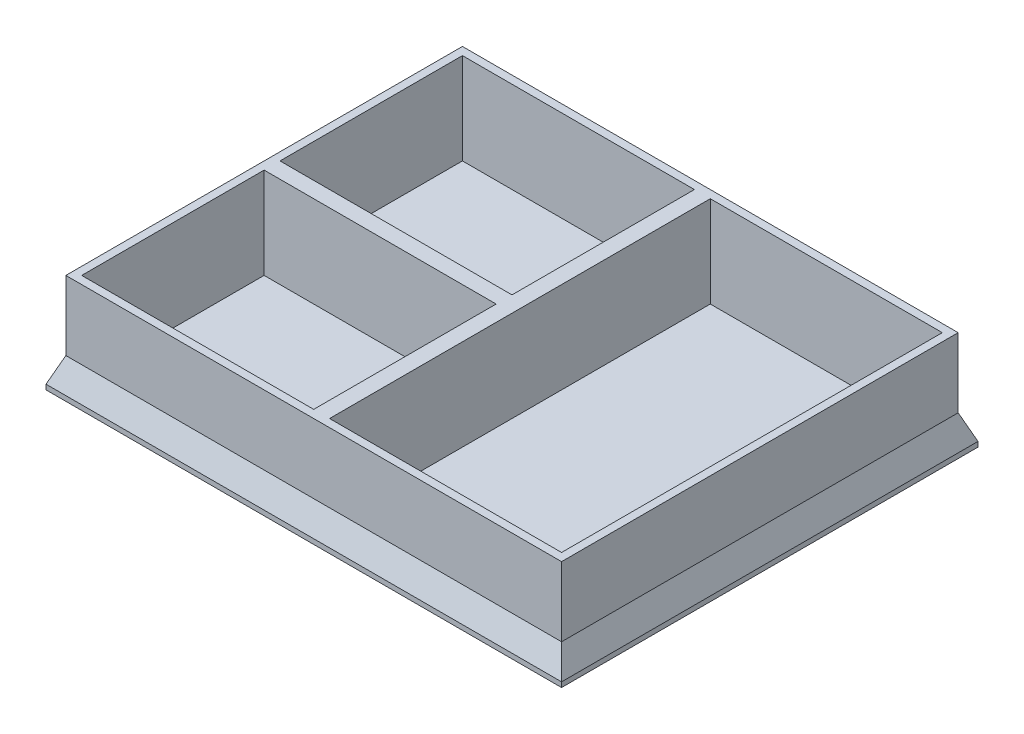
ISO-10303-21;
HEADER;
FILE_DESCRIPTION(('STEP AP214'),'2;1');
FILE_NAME('part.step','',(''),(''),'','','');
FILE_SCHEMA(('AUTOMOTIVE_DESIGN { 1 0 10303 214 1 1 1 1 }'));
ENDSEC;
DATA;
#1=APPLICATION_CONTEXT('core data for automotive mechanical design processes');
#2=APPLICATION_PROTOCOL_DEFINITION('international standard','automotive_design',2000,#1);
#3=PRODUCT_CONTEXT('',#1,'mechanical');
#4=PRODUCT('Part','Part','',(#3));
#5=PRODUCT_RELATED_PRODUCT_CATEGORY('part','',(#4));
#6=PRODUCT_DEFINITION_FORMATION('','',#4);
#7=PRODUCT_DEFINITION_CONTEXT('part definition',#1,'design');
#8=PRODUCT_DEFINITION('design','',#6,#7);
#9=PRODUCT_DEFINITION_SHAPE('','',#8);
#10=(LENGTH_UNIT() NAMED_UNIT(*) SI_UNIT(.MILLI.,.METRE.));
#11=(NAMED_UNIT(*) PLANE_ANGLE_UNIT() SI_UNIT($,.RADIAN.));
#12=(NAMED_UNIT(*) SI_UNIT($,.STERADIAN.) SOLID_ANGLE_UNIT());
#13=UNCERTAINTY_MEASURE_WITH_UNIT(LENGTH_MEASURE(1.E-05),#10,'distance_accuracy_value','');
#14=(GEOMETRIC_REPRESENTATION_CONTEXT(3) GLOBAL_UNCERTAINTY_ASSIGNED_CONTEXT((#13)) GLOBAL_UNIT_ASSIGNED_CONTEXT((#10,
#11,#12)) REPRESENTATION_CONTEXT('',''));
#15=CARTESIAN_POINT('',(0.,0.,0.));
#16=DIRECTION('',(0.,0.,1.));
#17=DIRECTION('',(1.,0.,0.));
#18=AXIS2_PLACEMENT_3D('',#15,#16,#17);
#19=CARTESIAN_POINT('',(0.,20.,-38.4));
#20=DIRECTION('',(0.,0.,-1.));
#21=DIRECTION('',(-1.,0.,0.));
#22=AXIS2_PLACEMENT_3D('',#19,#20,#21);
#23=PLANE('',#22);
#24=DIRECTION('',(-1.,0.,0.));
#25=VECTOR('',#24,1.);
#26=CARTESIAN_POINT('',(0.,1.6,-38.4));
#27=LINE('',#26,#25);
#28=CARTESIAN_POINT('',(48.4,1.6,-38.4));
#29=VERTEX_POINT('',#28);
#30=CARTESIAN_POINT('',(1.59999999999998,1.6,-38.4));
#31=VERTEX_POINT('',#30);
#32=EDGE_CURVE('E252',#29,#31,#27,.T.);
#33=ORIENTED_EDGE('',*,*,#32,.F.);
#34=DIRECTION('',(0.,-1.,0.));
#35=VECTOR('',#34,1.);
#36=CARTESIAN_POINT('',(48.4,20.,-38.4));
#37=LINE('',#36,#35);
#38=CARTESIAN_POINT('',(48.4,20.,-38.4));
#39=VERTEX_POINT('',#38);
#40=EDGE_CURVE('E324',#39,#29,#37,.T.);
#41=ORIENTED_EDGE('',*,*,#40,.F.);
#42=DIRECTION('',(1.,0.,0.));
#43=VECTOR('',#42,1.);
#44=CARTESIAN_POINT('',(0.,20.,-38.4));
#45=LINE('',#44,#43);
#46=CARTESIAN_POINT('',(1.59999999999998,20.,-38.4));
#47=VERTEX_POINT('',#46);
#48=EDGE_CURVE('E303',#47,#39,#45,.T.);
#49=ORIENTED_EDGE('',*,*,#48,.F.);
#50=DIRECTION('',(0.,-1.,0.));
#51=VECTOR('',#50,1.);
#52=CARTESIAN_POINT('',(1.59999999999998,20.,-38.4));
#53=LINE('',#52,#51);
#54=EDGE_CURVE('E314',#47,#31,#53,.T.);
#55=ORIENTED_EDGE('',*,*,#54,.T.);
#56=EDGE_LOOP('',(#33,#41,#49,#55));
#57=FACE_BOUND('',#56,.T.);
#58=ADVANCED_FACE('F35',(#57),#23,.F.);
#59=CARTESIAN_POINT('',(48.4,20.,0.));
#60=DIRECTION('',(1.,0.,0.));
#61=DIRECTION('',(0.,0.,-1.));
#62=AXIS2_PLACEMENT_3D('',#59,#60,#61);
#63=PLANE('',#62);
#64=DIRECTION('',(0.,0.,-1.));
#65=VECTOR('',#64,1.);
#66=CARTESIAN_POINT('',(48.4,1.6,0.));
#67=LINE('',#66,#65);
#68=CARTESIAN_POINT('',(48.4,1.6,38.4));
#69=VERTEX_POINT('',#68);
#70=EDGE_CURVE('E250',#69,#29,#67,.T.);
#71=ORIENTED_EDGE('',*,*,#70,.F.);
#72=DIRECTION('',(0.,-1.,0.));
#73=VECTOR('',#72,1.);
#74=CARTESIAN_POINT('',(48.4,20.,38.4));
#75=LINE('',#74,#73);
#76=CARTESIAN_POINT('',(48.4,20.,38.4));
#77=VERTEX_POINT('',#76);
#78=EDGE_CURVE('E321',#77,#69,#75,.T.);
#79=ORIENTED_EDGE('',*,*,#78,.F.);
#80=DIRECTION('',(0.,0.,1.));
#81=VECTOR('',#80,1.);
#82=CARTESIAN_POINT('',(48.4,20.,0.));
#83=LINE('',#82,#81);
#84=EDGE_CURVE('E306',#39,#77,#83,.T.);
#85=ORIENTED_EDGE('',*,*,#84,.F.);
#86=ORIENTED_EDGE('',*,*,#40,.T.);
#87=EDGE_LOOP('',(#71,#79,#85,#86));
#88=FACE_BOUND('',#87,.T.);
#89=ADVANCED_FACE('F380',(#88),#63,.F.);
#90=CARTESIAN_POINT('',(0.,20.,38.4));
#91=DIRECTION('',(0.,0.,-1.));
#92=DIRECTION('',(-1.,0.,0.));
#93=AXIS2_PLACEMENT_3D('',#90,#91,#92);
#94=PLANE('',#93);
#95=ORIENTED_EDGE('',*,*,#78,.T.);
#96=DIRECTION('',(-1.,0.,0.));
#97=VECTOR('',#96,1.);
#98=CARTESIAN_POINT('',(0.,1.6,38.4));
#99=LINE('',#98,#97);
#100=CARTESIAN_POINT('',(1.59999999999999,1.6,38.4));
#101=VERTEX_POINT('',#100);
#102=EDGE_CURVE('E242',#69,#101,#99,.T.);
#103=ORIENTED_EDGE('',*,*,#102,.T.);
#104=DIRECTION('',(0.,-1.,0.));
#105=VECTOR('',#104,1.);
#106=CARTESIAN_POINT('',(1.59999999999999,20.,38.4));
#107=LINE('',#106,#105);
#108=CARTESIAN_POINT('',(1.59999999999999,20.,38.4));
#109=VERTEX_POINT('',#108);
#110=EDGE_CURVE('E317',#109,#101,#107,.T.);
#111=ORIENTED_EDGE('',*,*,#110,.F.);
#112=DIRECTION('',(1.,0.,0.));
#113=VECTOR('',#112,1.);
#114=CARTESIAN_POINT('',(0.,20.,38.4));
#115=LINE('',#114,#113);
#116=EDGE_CURVE('E308',#109,#77,#115,.T.);
#117=ORIENTED_EDGE('',*,*,#116,.T.);
#118=EDGE_LOOP('',(#95,#103,#111,#117));
#119=FACE_BOUND('',#118,.T.);
#120=ADVANCED_FACE('F386',(#119),#94,.T.);
#121=CARTESIAN_POINT('',(0.,20.,1.60000000000002));
#122=DIRECTION('',(0.,0.,-1.));
#123=DIRECTION('',(-1.,0.,0.));
#124=AXIS2_PLACEMENT_3D('',#121,#122,#123);
#125=PLANE('',#124);
#126=DIRECTION('',(-1.,0.,0.));
#127=VECTOR('',#126,1.);
#128=CARTESIAN_POINT('',(0.,1.6,1.60000000000002));
#129=LINE('',#128,#127);
#130=CARTESIAN_POINT('',(-1.6,1.6,1.60000000000002));
#131=VERTEX_POINT('',#130);
#132=CARTESIAN_POINT('',(-48.4,1.6,1.60000000000002));
#133=VERTEX_POINT('',#132);
#134=EDGE_CURVE('E272',#131,#133,#129,.T.);
#135=ORIENTED_EDGE('',*,*,#134,.F.);
#136=DIRECTION('',(0.,-1.,0.));
#137=VECTOR('',#136,1.);
#138=CARTESIAN_POINT('',(-1.6,20.,1.60000000000002));
#139=LINE('',#138,#137);
#140=CARTESIAN_POINT('',(-1.6,20.,1.60000000000002));
#141=VERTEX_POINT('',#140);
#142=EDGE_CURVE('E318',#141,#131,#139,.T.);
#143=ORIENTED_EDGE('',*,*,#142,.F.);
#144=DIRECTION('',(1.,0.,0.));
#145=VECTOR('',#144,1.);
#146=CARTESIAN_POINT('',(0.,20.,1.60000000000002));
#147=LINE('',#146,#145);
#148=CARTESIAN_POINT('',(-48.4,20.,1.60000000000002));
#149=VERTEX_POINT('',#148);
#150=EDGE_CURVE('E292',#149,#141,#147,.T.);
#151=ORIENTED_EDGE('',*,*,#150,.F.);
#152=DIRECTION('',(0.,-1.,0.));
#153=VECTOR('',#152,1.);
#154=CARTESIAN_POINT('',(-48.4,20.,1.60000000000002));
#155=LINE('',#154,#153);
#156=EDGE_CURVE('E328',#149,#133,#155,.T.);
#157=ORIENTED_EDGE('',*,*,#156,.T.);
#158=EDGE_LOOP('',(#135,#143,#151,#157));
#159=FACE_BOUND('',#158,.T.);
#160=ADVANCED_FACE('F406',(#159),#125,.F.);
#161=CARTESIAN_POINT('',(-1.6,20.,0.));
#162=DIRECTION('',(1.,0.,0.));
#163=DIRECTION('',(0.,0.,-1.));
#164=AXIS2_PLACEMENT_3D('',#161,#162,#163);
#165=PLANE('',#164);
#166=DIRECTION('',(0.,0.,-1.));
#167=VECTOR('',#166,1.);
#168=CARTESIAN_POINT('',(-1.6,1.6,0.));
#169=LINE('',#168,#167);
#170=CARTESIAN_POINT('',(-1.59999999999999,1.6,38.4));
#171=VERTEX_POINT('',#170);
#172=EDGE_CURVE('E270',#171,#131,#169,.T.);
#173=ORIENTED_EDGE('',*,*,#172,.F.);
#174=DIRECTION('',(0.,-1.,0.));
#175=VECTOR('',#174,1.);
#176=CARTESIAN_POINT('',(-1.59999999999999,20.,38.4));
#177=LINE('',#176,#175);
#178=CARTESIAN_POINT('',(-1.59999999999999,20.,38.4));
#179=VERTEX_POINT('',#178);
#180=EDGE_CURVE('E335',#179,#171,#177,.T.);
#181=ORIENTED_EDGE('',*,*,#180,.F.);
#182=DIRECTION('',(0.,0.,1.));
#183=VECTOR('',#182,1.);
#184=CARTESIAN_POINT('',(-1.6,20.,0.));
#185=LINE('',#184,#183);
#186=EDGE_CURVE('E295',#141,#179,#185,.T.);
#187=ORIENTED_EDGE('',*,*,#186,.F.);
#188=ORIENTED_EDGE('',*,*,#142,.T.);
#189=EDGE_LOOP('',(#173,#181,#187,#188));
#190=FACE_BOUND('',#189,.T.);
#191=ADVANCED_FACE('F402',(#190),#165,.F.);
#192=CARTESIAN_POINT('',(0.,20.,38.4));
#193=DIRECTION('',(0.,0.,-1.));
#194=DIRECTION('',(-1.,0.,0.));
#195=AXIS2_PLACEMENT_3D('',#192,#193,#194);
#196=PLANE('',#195);
#197=ORIENTED_EDGE('',*,*,#180,.T.);
#198=DIRECTION('',(-1.,0.,0.));
#199=VECTOR('',#198,1.);
#200=CARTESIAN_POINT('',(0.,1.6,38.4));
#201=LINE('',#200,#199);
#202=CARTESIAN_POINT('',(-48.4,1.6,38.4));
#203=VERTEX_POINT('',#202);
#204=EDGE_CURVE('E267',#171,#203,#201,.T.);
#205=ORIENTED_EDGE('',*,*,#204,.T.);
#206=DIRECTION('',(0.,-1.,0.));
#207=VECTOR('',#206,1.);
#208=CARTESIAN_POINT('',(-48.4,20.,38.4));
#209=LINE('',#208,#207);
#210=CARTESIAN_POINT('',(-48.4,20.,38.4));
#211=VERTEX_POINT('',#210);
#212=EDGE_CURVE('E331',#211,#203,#209,.T.);
#213=ORIENTED_EDGE('',*,*,#212,.F.);
#214=DIRECTION('',(1.,0.,0.));
#215=VECTOR('',#214,1.);
#216=CARTESIAN_POINT('',(0.,20.,38.4));
#217=LINE('',#216,#215);
#218=EDGE_CURVE('E297',#211,#179,#217,.T.);
#219=ORIENTED_EDGE('',*,*,#218,.T.);
#220=EDGE_LOOP('',(#197,#205,#213,#219));
#221=FACE_BOUND('',#220,.T.);
#222=ADVANCED_FACE('F398',(#221),#196,.T.);
#223=CARTESIAN_POINT('',(0.,20.,-38.4));
#224=DIRECTION('',(0.,0.,-1.));
#225=DIRECTION('',(-1.,0.,0.));
#226=AXIS2_PLACEMENT_3D('',#223,#224,#225);
#227=PLANE('',#226);
#228=DIRECTION('',(-1.,0.,0.));
#229=VECTOR('',#228,1.);
#230=CARTESIAN_POINT('',(0.,1.6,-38.4));
#231=LINE('',#230,#229);
#232=CARTESIAN_POINT('',(-1.6,1.6,-38.4));
#233=VERTEX_POINT('',#232);
#234=CARTESIAN_POINT('',(-48.4,1.6,-38.4));
#235=VERTEX_POINT('',#234);
#236=EDGE_CURVE('E262',#233,#235,#231,.T.);
#237=ORIENTED_EDGE('',*,*,#236,.F.);
#238=DIRECTION('',(0.,-1.,0.));
#239=VECTOR('',#238,1.);
#240=CARTESIAN_POINT('',(-1.6,20.,-38.4));
#241=LINE('',#240,#239);
#242=CARTESIAN_POINT('',(-1.6,20.,-38.4));
#243=VERTEX_POINT('',#242);
#244=EDGE_CURVE('E332',#243,#233,#241,.T.);
#245=ORIENTED_EDGE('',*,*,#244,.F.);
#246=DIRECTION('',(1.,0.,0.));
#247=VECTOR('',#246,1.);
#248=CARTESIAN_POINT('',(0.,20.,-38.4));
#249=LINE('',#248,#247);
#250=CARTESIAN_POINT('',(-48.4,20.,-38.4));
#251=VERTEX_POINT('',#250);
#252=EDGE_CURVE('E281',#251,#243,#249,.T.);
#253=ORIENTED_EDGE('',*,*,#252,.F.);
#254=DIRECTION('',(0.,-1.,0.));
#255=VECTOR('',#254,1.);
#256=CARTESIAN_POINT('',(-48.4,20.,-38.4));
#257=LINE('',#256,#255);
#258=EDGE_CURVE('E196',#251,#235,#257,.T.);
#259=ORIENTED_EDGE('',*,*,#258,.T.);
#260=EDGE_LOOP('',(#237,#245,#253,#259));
#261=FACE_BOUND('',#260,.T.);
#262=ADVANCED_FACE('F401',(#261),#227,.F.);
#263=CARTESIAN_POINT('',(-1.59999999999999,20.,0.));
#264=DIRECTION('',(1.,0.,0.));
#265=DIRECTION('',(0.,0.,-1.));
#266=AXIS2_PLACEMENT_3D('',#263,#264,#265);
#267=PLANE('',#266);
#268=DIRECTION('',(0.,0.,-1.));
#269=VECTOR('',#268,1.);
#270=CARTESIAN_POINT('',(-1.59999999999999,1.6,0.));
#271=LINE('',#270,#269);
#272=CARTESIAN_POINT('',(-1.59999999999999,1.6,-1.6));
#273=VERTEX_POINT('',#272);
#274=EDGE_CURVE('E260',#273,#233,#271,.T.);
#275=ORIENTED_EDGE('',*,*,#274,.F.);
#276=DIRECTION('',(0.,-1.,0.));
#277=VECTOR('',#276,1.);
#278=CARTESIAN_POINT('',(-1.59999999999999,20.,-1.6));
#279=LINE('',#278,#277);
#280=CARTESIAN_POINT('',(-1.59999999999999,20.,-1.6));
#281=VERTEX_POINT('',#280);
#282=EDGE_CURVE('E345',#281,#273,#279,.T.);
#283=ORIENTED_EDGE('',*,*,#282,.F.);
#284=DIRECTION('',(0.,0.,1.));
#285=VECTOR('',#284,1.);
#286=CARTESIAN_POINT('',(-1.59999999999999,20.,0.));
#287=LINE('',#286,#285);
#288=EDGE_CURVE('E284',#243,#281,#287,.T.);
#289=ORIENTED_EDGE('',*,*,#288,.F.);
#290=ORIENTED_EDGE('',*,*,#244,.T.);
#291=EDGE_LOOP('',(#275,#283,#289,#290));
#292=FACE_BOUND('',#291,.T.);
#293=ADVANCED_FACE('F418',(#292),#267,.F.);
#294=CARTESIAN_POINT('',(0.,20.,-1.6));
#295=DIRECTION('',(0.,0.,-1.));
#296=DIRECTION('',(-1.,0.,0.));
#297=AXIS2_PLACEMENT_3D('',#294,#295,#296);
#298=PLANE('',#297);
#299=ORIENTED_EDGE('',*,*,#282,.T.);
#300=DIRECTION('',(-1.,0.,0.));
#301=VECTOR('',#300,1.);
#302=CARTESIAN_POINT('',(0.,1.6,-1.6));
#303=LINE('',#302,#301);
#304=CARTESIAN_POINT('',(-48.4,1.6,-1.6));
#305=VERTEX_POINT('',#304);
#306=EDGE_CURVE('E257',#273,#305,#303,.T.);
#307=ORIENTED_EDGE('',*,*,#306,.T.);
#308=DIRECTION('',(0.,-1.,0.));
#309=VECTOR('',#308,1.);
#310=CARTESIAN_POINT('',(-48.4,20.,-1.6));
#311=LINE('',#310,#309);
#312=CARTESIAN_POINT('',(-48.4,20.,-1.6));
#313=VERTEX_POINT('',#312);
#314=EDGE_CURVE('E342',#313,#305,#311,.T.);
#315=ORIENTED_EDGE('',*,*,#314,.F.);
#316=DIRECTION('',(1.,0.,0.));
#317=VECTOR('',#316,1.);
#318=CARTESIAN_POINT('',(0.,20.,-1.6));
#319=LINE('',#318,#317);
#320=EDGE_CURVE('E286',#313,#281,#319,.T.);
#321=ORIENTED_EDGE('',*,*,#320,.T.);
#322=EDGE_LOOP('',(#299,#307,#315,#321));
#323=FACE_BOUND('',#322,.T.);
#324=ADVANCED_FACE('F415',(#323),#298,.T.);
#325=CARTESIAN_POINT('',(50.,20.,0.));
#326=DIRECTION('',(1.,0.,0.));
#327=DIRECTION('',(0.,0.,-1.));
#328=AXIS2_PLACEMENT_3D('',#325,#326,#327);
#329=PLANE('',#328);
#330=DIRECTION('',(0.,0.,1.));
#331=VECTOR('',#330,1.);
#332=CARTESIAN_POINT('',(50.,6.,0.));
#333=LINE('',#332,#331);
#334=CARTESIAN_POINT('',(50.,6.,-40.));
#335=VERTEX_POINT('',#334);
#336=CARTESIAN_POINT('',(50.,6.,40.));
#337=VERTEX_POINT('',#336);
#338=EDGE_CURVE('E173',#335,#337,#333,.T.);
#339=ORIENTED_EDGE('',*,*,#338,.F.);
#340=DIRECTION('',(0.,-1.,0.));
#341=VECTOR('',#340,1.);
#342=CARTESIAN_POINT('',(50.,20.,-40.));
#343=LINE('',#342,#341);
#344=CARTESIAN_POINT('',(50.,20.,-40.));
#345=VERTEX_POINT('',#344);
#346=EDGE_CURVE('E177',#345,#335,#343,.T.);
#347=ORIENTED_EDGE('',*,*,#346,.F.);
#348=DIRECTION('',(0.,0.,1.));
#349=VECTOR('',#348,1.);
#350=CARTESIAN_POINT('',(50.,20.,0.));
#351=LINE('',#350,#349);
#352=CARTESIAN_POINT('',(50.,20.,40.));
#353=VERTEX_POINT('',#352);
#354=EDGE_CURVE('E274',#345,#353,#351,.T.);
#355=ORIENTED_EDGE('',*,*,#354,.T.);
#356=DIRECTION('',(0.,-1.,0.));
#357=VECTOR('',#356,1.);
#358=CARTESIAN_POINT('',(50.,20.,40.));
#359=LINE('',#358,#357);
#360=EDGE_CURVE('E180',#353,#337,#359,.T.);
#361=ORIENTED_EDGE('',*,*,#360,.T.);
#362=EDGE_LOOP('',(#339,#347,#355,#361));
#363=FACE_BOUND('',#362,.T.);
#364=ADVANCED_FACE('F175',(#363),#329,.T.);
#365=CARTESIAN_POINT('',(0.,20.,-40.));
#366=DIRECTION('',(0.,0.,-1.));
#367=DIRECTION('',(-1.,0.,0.));
#368=AXIS2_PLACEMENT_3D('',#365,#366,#367);
#369=PLANE('',#368);
#370=DIRECTION('',(1.,0.,0.));
#371=VECTOR('',#370,1.);
#372=CARTESIAN_POINT('',(0.,6.,-40.));
#373=LINE('',#372,#371);
#374=CARTESIAN_POINT('',(-50.,6.,-40.));
#375=VERTEX_POINT('',#374);
#376=EDGE_CURVE('E186',#375,#335,#373,.T.);
#377=ORIENTED_EDGE('',*,*,#376,.F.);
#378=DIRECTION('',(0.,-1.,0.));
#379=VECTOR('',#378,1.);
#380=CARTESIAN_POINT('',(-50.,20.,-40.));
#381=LINE('',#380,#379);
#382=CARTESIAN_POINT('',(-50.,20.,-40.));
#383=VERTEX_POINT('',#382);
#384=EDGE_CURVE('E197',#383,#375,#381,.T.);
#385=ORIENTED_EDGE('',*,*,#384,.F.);
#386=DIRECTION('',(1.,0.,0.));
#387=VECTOR('',#386,1.);
#388=CARTESIAN_POINT('',(0.,20.,-40.));
#389=LINE('',#388,#387);
#390=EDGE_CURVE('E195',#383,#345,#389,.T.);
#391=ORIENTED_EDGE('',*,*,#390,.T.);
#392=ORIENTED_EDGE('',*,*,#346,.T.);
#393=EDGE_LOOP('',(#377,#385,#391,#392));
#394=FACE_BOUND('',#393,.T.);
#395=ADVANCED_FACE('F192',(#394),#369,.T.);
#396=CARTESIAN_POINT('',(-50.,20.,0.));
#397=DIRECTION('',(1.,0.,0.));
#398=DIRECTION('',(0.,0.,-1.));
#399=AXIS2_PLACEMENT_3D('',#396,#397,#398);
#400=PLANE('',#399);
#401=ORIENTED_EDGE('',*,*,#384,.T.);
#402=DIRECTION('',(0.,0.,1.));
#403=VECTOR('',#402,1.);
#404=CARTESIAN_POINT('',(-50.,6.,0.));
#405=LINE('',#404,#403);
#406=CARTESIAN_POINT('',(-50.,6.,40.));
#407=VERTEX_POINT('',#406);
#408=EDGE_CURVE('E218',#375,#407,#405,.T.);
#409=ORIENTED_EDGE('',*,*,#408,.T.);
#410=DIRECTION('',(0.,-1.,0.));
#411=VECTOR('',#410,1.);
#412=CARTESIAN_POINT('',(-50.,20.,40.));
#413=LINE('',#412,#411);
#414=CARTESIAN_POINT('',(-50.,20.,40.));
#415=VERTEX_POINT('',#414);
#416=EDGE_CURVE('E351',#415,#407,#413,.T.);
#417=ORIENTED_EDGE('',*,*,#416,.F.);
#418=DIRECTION('',(0.,0.,1.));
#419=VECTOR('',#418,1.);
#420=CARTESIAN_POINT('',(-50.,20.,0.));
#421=LINE('',#420,#419);
#422=EDGE_CURVE('E277',#383,#415,#421,.T.);
#423=ORIENTED_EDGE('',*,*,#422,.F.);
#424=EDGE_LOOP('',(#401,#409,#417,#423));
#425=FACE_BOUND('',#424,.T.);
#426=ADVANCED_FACE('F396',(#425),#400,.F.);
#427=CARTESIAN_POINT('',(-48.4,20.,0.));
#428=DIRECTION('',(1.,0.,0.));
#429=DIRECTION('',(0.,0.,-1.));
#430=AXIS2_PLACEMENT_3D('',#427,#428,#429);
#431=PLANE('',#430);
#432=ORIENTED_EDGE('',*,*,#212,.T.);
#433=DIRECTION('',(0.,0.,-1.));
#434=VECTOR('',#433,1.);
#435=CARTESIAN_POINT('',(-48.4,1.6,0.));
#436=LINE('',#435,#434);
#437=EDGE_CURVE('E264',#203,#133,#436,.T.);
#438=ORIENTED_EDGE('',*,*,#437,.T.);
#439=ORIENTED_EDGE('',*,*,#156,.F.);
#440=DIRECTION('',(0.,0.,1.));
#441=VECTOR('',#440,1.);
#442=CARTESIAN_POINT('',(-48.4,20.,0.));
#443=LINE('',#442,#441);
#444=EDGE_CURVE('E300',#149,#211,#443,.T.);
#445=ORIENTED_EDGE('',*,*,#444,.T.);
#446=EDGE_LOOP('',(#432,#438,#439,#445));
#447=FACE_BOUND('',#446,.T.);
#448=ADVANCED_FACE('F392',(#447),#431,.T.);
#449=CARTESIAN_POINT('',(-48.4,20.,0.));
#450=DIRECTION('',(1.,0.,0.));
#451=DIRECTION('',(0.,0.,-1.));
#452=AXIS2_PLACEMENT_3D('',#449,#450,#451);
#453=PLANE('',#452);
#454=ORIENTED_EDGE('',*,*,#314,.T.);
#455=DIRECTION('',(0.,0.,-1.));
#456=VECTOR('',#455,1.);
#457=CARTESIAN_POINT('',(-48.4,1.6,0.));
#458=LINE('',#457,#456);
#459=EDGE_CURVE('E254',#305,#235,#458,.T.);
#460=ORIENTED_EDGE('',*,*,#459,.T.);
#461=ORIENTED_EDGE('',*,*,#258,.F.);
#462=DIRECTION('',(0.,0.,1.));
#463=VECTOR('',#462,1.);
#464=CARTESIAN_POINT('',(-48.4,20.,0.));
#465=LINE('',#464,#463);
#466=EDGE_CURVE('E289',#251,#313,#465,.T.);
#467=ORIENTED_EDGE('',*,*,#466,.T.);
#468=EDGE_LOOP('',(#454,#460,#461,#467));
#469=FACE_BOUND('',#468,.T.);
#470=ADVANCED_FACE('F395',(#469),#453,.T.);
#471=CARTESIAN_POINT('',(0.,20.,40.));
#472=DIRECTION('',(0.,0.,-1.));
#473=DIRECTION('',(-1.,0.,0.));
#474=AXIS2_PLACEMENT_3D('',#471,#472,#473);
#475=PLANE('',#474);
#476=ORIENTED_EDGE('',*,*,#416,.T.);
#477=DIRECTION('',(1.,0.,0.));
#478=VECTOR('',#477,1.);
#479=CARTESIAN_POINT('',(0.,6.,40.));
#480=LINE('',#479,#478);
#481=EDGE_CURVE('E185',#407,#337,#480,.T.);
#482=ORIENTED_EDGE('',*,*,#481,.T.);
#483=ORIENTED_EDGE('',*,*,#360,.F.);
#484=DIRECTION('',(1.,0.,0.));
#485=VECTOR('',#484,1.);
#486=CARTESIAN_POINT('',(0.,20.,40.));
#487=LINE('',#486,#485);
#488=EDGE_CURVE('E279',#415,#353,#487,.T.);
#489=ORIENTED_EDGE('',*,*,#488,.F.);
#490=EDGE_LOOP('',(#476,#482,#483,#489));
#491=FACE_BOUND('',#490,.T.);
#492=ADVANCED_FACE('F413',(#491),#475,.F.);
#493=CARTESIAN_POINT('',(1.59999999999999,20.,0.));
#494=DIRECTION('',(1.,0.,0.));
#495=DIRECTION('',(0.,0.,-1.));
#496=AXIS2_PLACEMENT_3D('',#493,#494,#495);
#497=PLANE('',#496);
#498=ORIENTED_EDGE('',*,*,#110,.T.);
#499=DIRECTION('',(0.,0.,-1.));
#500=VECTOR('',#499,1.);
#501=CARTESIAN_POINT('',(1.59999999999999,1.6,0.));
#502=LINE('',#501,#500);
#503=EDGE_CURVE('E327',#101,#31,#502,.T.);
#504=ORIENTED_EDGE('',*,*,#503,.T.);
#505=ORIENTED_EDGE('',*,*,#54,.F.);
#506=DIRECTION('',(0.,0.,1.));
#507=VECTOR('',#506,1.);
#508=CARTESIAN_POINT('',(1.59999999999999,20.,0.));
#509=LINE('',#508,#507);
#510=EDGE_CURVE('E311',#47,#109,#509,.T.);
#511=ORIENTED_EDGE('',*,*,#510,.T.);
#512=EDGE_LOOP('',(#498,#504,#505,#511));
#513=FACE_BOUND('',#512,.T.);
#514=ADVANCED_FACE('F428',(#513),#497,.T.);
#515=CARTESIAN_POINT('',(0.,20.,0.));
#516=DIRECTION('',(0.,1.,0.));
#517=DIRECTION('',(0.,0.,1.));
#518=AXIS2_PLACEMENT_3D('',#515,#516,#517);
#519=PLANE('',#518);
#520=ORIENTED_EDGE('',*,*,#354,.F.);
#521=ORIENTED_EDGE('',*,*,#390,.F.);
#522=ORIENTED_EDGE('',*,*,#422,.T.);
#523=ORIENTED_EDGE('',*,*,#488,.T.);
#524=EDGE_LOOP('',(#520,#521,#522,#523));
#525=FACE_BOUND('',#524,.T.);
#526=ORIENTED_EDGE('',*,*,#252,.T.);
#527=ORIENTED_EDGE('',*,*,#288,.T.);
#528=ORIENTED_EDGE('',*,*,#320,.F.);
#529=ORIENTED_EDGE('',*,*,#466,.F.);
#530=EDGE_LOOP('',(#526,#527,#528,#529));
#531=FACE_BOUND('',#530,.T.);
#532=ORIENTED_EDGE('',*,*,#150,.T.);
#533=ORIENTED_EDGE('',*,*,#186,.T.);
#534=ORIENTED_EDGE('',*,*,#218,.F.);
#535=ORIENTED_EDGE('',*,*,#444,.F.);
#536=EDGE_LOOP('',(#532,#533,#534,#535));
#537=FACE_BOUND('',#536,.T.);
#538=ORIENTED_EDGE('',*,*,#48,.T.);
#539=ORIENTED_EDGE('',*,*,#84,.T.);
#540=ORIENTED_EDGE('',*,*,#116,.F.);
#541=ORIENTED_EDGE('',*,*,#510,.F.);
#542=EDGE_LOOP('',(#538,#539,#540,#541));
#543=FACE_BOUND('',#542,.T.);
#544=ADVANCED_FACE('F545',(#525,#531,#537,#543),#519,.T.);
#545=CARTESIAN_POINT('',(0.,1.6,0.));
#546=DIRECTION('',(0.,-1.,0.));
#547=DIRECTION('',(0.,0.,-1.));
#548=AXIS2_PLACEMENT_3D('',#545,#546,#547);
#549=PLANE('',#548);
#550=ORIENTED_EDGE('',*,*,#70,.T.);
#551=ORIENTED_EDGE('',*,*,#32,.T.);
#552=ORIENTED_EDGE('',*,*,#503,.F.);
#553=ORIENTED_EDGE('',*,*,#102,.F.);
#554=EDGE_LOOP('',(#550,#551,#552,#553));
#555=FACE_BOUND('',#554,.T.);
#556=ADVANCED_FACE('F532',(#555),#549,.F.);
#557=ORIENTED_EDGE('',*,*,#274,.T.);
#558=ORIENTED_EDGE('',*,*,#236,.T.);
#559=ORIENTED_EDGE('',*,*,#459,.F.);
#560=ORIENTED_EDGE('',*,*,#306,.F.);
#561=EDGE_LOOP('',(#557,#558,#559,#560));
#562=FACE_BOUND('',#561,.T.);
#563=ADVANCED_FACE('F529',(#562),#549,.F.);
#564=ORIENTED_EDGE('',*,*,#172,.T.);
#565=ORIENTED_EDGE('',*,*,#134,.T.);
#566=ORIENTED_EDGE('',*,*,#437,.F.);
#567=ORIENTED_EDGE('',*,*,#204,.F.);
#568=EDGE_LOOP('',(#564,#565,#566,#567));
#569=FACE_BOUND('',#568,.T.);
#570=ADVANCED_FACE('F517',(#569),#549,.F.);
#571=CARTESIAN_POINT('',(0.,0.,0.));
#572=DIRECTION('',(0.,1.,0.));
#573=DIRECTION('',(0.,0.,1.));
#574=AXIS2_PLACEMENT_3D('',#571,#572,#573);
#575=PLANE('',#574);
#576=DIRECTION('',(1.,0.,0.));
#577=VECTOR('',#576,1.);
#578=CARTESIAN_POINT('',(-52.,0.,-42.));
#579=LINE('',#578,#577);
#580=CARTESIAN_POINT('',(-52.,0.,-42.));
#581=VERTEX_POINT('',#580);
#582=CARTESIAN_POINT('',(52.,0.,-42.));
#583=VERTEX_POINT('',#582);
#584=EDGE_CURVE('E225',#581,#583,#579,.T.);
#585=ORIENTED_EDGE('',*,*,#584,.T.);
#586=DIRECTION('',(0.,0.,1.));
#587=VECTOR('',#586,1.);
#588=CARTESIAN_POINT('',(52.,0.,-42.));
#589=LINE('',#588,#587);
#590=CARTESIAN_POINT('',(52.,0.,42.));
#591=VERTEX_POINT('',#590);
#592=EDGE_CURVE('E230',#583,#591,#589,.T.);
#593=ORIENTED_EDGE('',*,*,#592,.T.);
#594=DIRECTION('',(1.,0.,0.));
#595=VECTOR('',#594,1.);
#596=CARTESIAN_POINT('',(-52.,0.,42.));
#597=LINE('',#596,#595);
#598=CARTESIAN_POINT('',(-52.,0.,42.));
#599=VERTEX_POINT('',#598);
#600=EDGE_CURVE('E233',#599,#591,#597,.T.);
#601=ORIENTED_EDGE('',*,*,#600,.F.);
#602=DIRECTION('',(0.,0.,1.));
#603=VECTOR('',#602,1.);
#604=CARTESIAN_POINT('',(-52.,0.,-42.));
#605=LINE('',#604,#603);
#606=EDGE_CURVE('E236',#581,#599,#605,.T.);
#607=ORIENTED_EDGE('',*,*,#606,.F.);
#608=EDGE_LOOP('',(#585,#593,#601,#607));
#609=FACE_BOUND('',#608,.T.);
#610=ADVANCED_FACE('F367',(#609),#575,.F.);
#611=CARTESIAN_POINT('',(-52.,1.6,42.));
#612=DIRECTION('',(0.,0.,-1.));
#613=DIRECTION('',(-1.,0.,0.));
#614=AXIS2_PLACEMENT_3D('',#611,#612,#613);
#615=PLANE('',#614);
#616=DIRECTION('',(0.,-1.,0.));
#617=VECTOR('',#616,1.);
#618=CARTESIAN_POINT('',(52.,1.6,42.));
#619=LINE('',#618,#617);
#620=CARTESIAN_POINT('',(52.,0.99999999999994,42.));
#621=VERTEX_POINT('',#620);
#622=EDGE_CURVE('E245',#621,#591,#619,.T.);
#623=ORIENTED_EDGE('',*,*,#622,.F.);
#624=DIRECTION('',(-1.,0.,0.));
#625=VECTOR('',#624,1.);
#626=CARTESIAN_POINT('',(-52.,0.99999999999994,42.));
#627=LINE('',#626,#625);
#628=CARTESIAN_POINT('',(-52.,0.99999999999994,42.));
#629=VERTEX_POINT('',#628);
#630=EDGE_CURVE('E45',#621,#629,#627,.T.);
#631=ORIENTED_EDGE('',*,*,#630,.T.);
#632=DIRECTION('',(0.,-1.,0.));
#633=VECTOR('',#632,1.);
#634=CARTESIAN_POINT('',(-52.,1.6,42.));
#635=LINE('',#634,#633);
#636=EDGE_CURVE('E243',#629,#599,#635,.T.);
#637=ORIENTED_EDGE('',*,*,#636,.T.);
#638=ORIENTED_EDGE('',*,*,#600,.T.);
#639=EDGE_LOOP('',(#623,#631,#637,#638));
#640=FACE_BOUND('',#639,.T.);
#641=ADVANCED_FACE('F369',(#640),#615,.F.);
#642=CARTESIAN_POINT('',(-52.,1.6,-42.));
#643=DIRECTION('',(1.,0.,0.));
#644=DIRECTION('',(0.,0.,-1.));
#645=AXIS2_PLACEMENT_3D('',#642,#643,#644);
#646=PLANE('',#645);
#647=ORIENTED_EDGE('',*,*,#636,.F.);
#648=DIRECTION('',(0.,0.,-1.));
#649=VECTOR('',#648,1.);
#650=CARTESIAN_POINT('',(-52.,0.99999999999994,-42.));
#651=LINE('',#650,#649);
#652=CARTESIAN_POINT('',(-52.,0.99999999999994,-42.));
#653=VERTEX_POINT('',#652);
#654=EDGE_CURVE('E219',#629,#653,#651,.T.);
#655=ORIENTED_EDGE('',*,*,#654,.T.);
#656=DIRECTION('',(0.,-1.,0.));
#657=VECTOR('',#656,1.);
#658=CARTESIAN_POINT('',(-52.,1.6,-42.));
#659=LINE('',#658,#657);
#660=EDGE_CURVE('E240',#653,#581,#659,.T.);
#661=ORIENTED_EDGE('',*,*,#660,.T.);
#662=ORIENTED_EDGE('',*,*,#606,.T.);
#663=EDGE_LOOP('',(#647,#655,#661,#662));
#664=FACE_BOUND('',#663,.T.);
#665=ADVANCED_FACE('F360',(#664),#646,.F.);
#666=CARTESIAN_POINT('',(-52.,1.6,-42.));
#667=DIRECTION('',(0.,0.,-1.));
#668=DIRECTION('',(-1.,0.,0.));
#669=AXIS2_PLACEMENT_3D('',#666,#667,#668);
#670=PLANE('',#669);
#671=ORIENTED_EDGE('',*,*,#660,.F.);
#672=DIRECTION('',(1.,0.,0.));
#673=VECTOR('',#672,1.);
#674=CARTESIAN_POINT('',(-52.,0.99999999999994,-42.));
#675=LINE('',#674,#673);
#676=CARTESIAN_POINT('',(52.,0.99999999999994,-42.));
#677=VERTEX_POINT('',#676);
#678=EDGE_CURVE('E356',#653,#677,#675,.T.);
#679=ORIENTED_EDGE('',*,*,#678,.T.);
#680=DIRECTION('',(0.,-1.,0.));
#681=VECTOR('',#680,1.);
#682=CARTESIAN_POINT('',(52.,1.6,-42.));
#683=LINE('',#682,#681);
#684=EDGE_CURVE('E239',#677,#583,#683,.T.);
#685=ORIENTED_EDGE('',*,*,#684,.T.);
#686=ORIENTED_EDGE('',*,*,#584,.F.);
#687=EDGE_LOOP('',(#671,#679,#685,#686));
#688=FACE_BOUND('',#687,.T.);
#689=ADVANCED_FACE('F364',(#688),#670,.T.);
#690=CARTESIAN_POINT('',(52.,1.6,-42.));
#691=DIRECTION('',(1.,0.,0.));
#692=DIRECTION('',(0.,0.,-1.));
#693=AXIS2_PLACEMENT_3D('',#690,#691,#692);
#694=PLANE('',#693);
#695=ORIENTED_EDGE('',*,*,#684,.F.);
#696=DIRECTION('',(0.,0.,1.));
#697=VECTOR('',#696,1.);
#698=CARTESIAN_POINT('',(52.,0.99999999999994,-42.));
#699=LINE('',#698,#697);
#700=EDGE_CURVE('E11',#677,#621,#699,.T.);
#701=ORIENTED_EDGE('',*,*,#700,.T.);
#702=ORIENTED_EDGE('',*,*,#622,.T.);
#703=ORIENTED_EDGE('',*,*,#592,.F.);
#704=EDGE_LOOP('',(#695,#701,#702,#703));
#705=FACE_BOUND('',#704,.T.);
#706=ADVANCED_FACE('F370',(#705),#694,.T.);
#707=CARTESIAN_POINT('',(0.,6.,40.));
#708=DIRECTION('',(0.,0.371390676354101,0.92847669088526));
#709=DIRECTION('',(-1.,0.,0.));
#710=AXIS2_PLACEMENT_3D('',#707,#708,#709);
#711=PLANE('',#710);
#712=DIRECTION('',(-0.348155311911394,0.870388279778491,-0.348155311911394));
#713=VECTOR('',#712,1.);
#714=CARTESIAN_POINT('',(41.8181818181819,26.4545454545453,31.8181818181819));
#715=LINE('',#714,#713);
#716=EDGE_CURVE('E210',#337,#621,#715,.F.);
#717=ORIENTED_EDGE('',*,*,#716,.F.);
#718=ORIENTED_EDGE('',*,*,#481,.F.);
#719=DIRECTION('',(-0.348155311911394,-0.870388279778491,0.348155311911394));
#720=VECTOR('',#719,1.);
#721=CARTESIAN_POINT('',(-43.939393939394,21.1515151515151,33.939393939394));
#722=LINE('',#721,#720);
#723=EDGE_CURVE('E40',#629,#407,#722,.F.);
#724=ORIENTED_EDGE('',*,*,#723,.F.);
#725=ORIENTED_EDGE('',*,*,#630,.F.);
#726=EDGE_LOOP('',(#717,#718,#724,#725));
#727=FACE_BOUND('',#726,.T.);
#728=ADVANCED_FACE('F38',(#727),#711,.T.);
#729=CARTESIAN_POINT('',(-50.,6.,0.));
#730=DIRECTION('',(-0.92847669088526,0.371390676354101,0.));
#731=DIRECTION('',(0.,0.,-1.));
#732=AXIS2_PLACEMENT_3D('',#729,#730,#731);
#733=PLANE('',#732);
#734=ORIENTED_EDGE('',*,*,#723,.T.);
#735=ORIENTED_EDGE('',*,*,#408,.F.);
#736=DIRECTION('',(0.348155311911394,0.870388279778491,0.348155311911394));
#737=VECTOR('',#736,1.);
#738=CARTESIAN_POINT('',(-45.1515151515152,18.1212121212121,-35.1515151515152));
#739=LINE('',#738,#737);
#740=EDGE_CURVE('E204',#653,#375,#739,.T.);
#741=ORIENTED_EDGE('',*,*,#740,.F.);
#742=ORIENTED_EDGE('',*,*,#654,.F.);
#743=EDGE_LOOP('',(#734,#735,#741,#742));
#744=FACE_BOUND('',#743,.T.);
#745=ADVANCED_FACE('F217',(#744),#733,.T.);
#746=CARTESIAN_POINT('',(52.,0.99999999999994,-42.));
#747=DIRECTION('',(-0.92847669088526,-0.371390676354101,0.));
#748=DIRECTION('',(0.,0.,1.));
#749=AXIS2_PLACEMENT_3D('',#746,#747,#748);
#750=PLANE('',#749);
#751=ORIENTED_EDGE('',*,*,#716,.T.);
#752=ORIENTED_EDGE('',*,*,#700,.F.);
#753=DIRECTION('',(-0.348155311911394,0.870388279778491,0.348155311911394));
#754=VECTOR('',#753,1.);
#755=CARTESIAN_POINT('',(52.,0.99999999999994,-42.));
#756=LINE('',#755,#754);
#757=EDGE_CURVE('E202',#335,#677,#756,.F.);
#758=ORIENTED_EDGE('',*,*,#757,.F.);
#759=ORIENTED_EDGE('',*,*,#338,.T.);
#760=EDGE_LOOP('',(#751,#752,#758,#759));
#761=FACE_BOUND('',#760,.T.);
#762=ADVANCED_FACE('F207',(#761),#750,.F.);
#763=CARTESIAN_POINT('',(-52.,0.99999999999994,-42.));
#764=DIRECTION('',(0.,-0.371390676354101,0.92847669088526));
#765=DIRECTION('',(1.,0.,0.));
#766=AXIS2_PLACEMENT_3D('',#763,#764,#765);
#767=PLANE('',#766);
#768=ORIENTED_EDGE('',*,*,#740,.T.);
#769=ORIENTED_EDGE('',*,*,#376,.T.);
#770=ORIENTED_EDGE('',*,*,#757,.T.);
#771=ORIENTED_EDGE('',*,*,#678,.F.);
#772=EDGE_LOOP('',(#768,#769,#770,#771));
#773=FACE_BOUND('',#772,.T.);
#774=ADVANCED_FACE('F200',(#773),#767,.F.);
#775=CLOSED_SHELL('',(#58,#89,#120,#160,#191,#222,#262,#293,#324,#364,#395,#426,#448,#470,#492,
#514,#544,#556,#563,#570,#610,#641,#665,#689,#706,#728,#745,#762,#774));
#776=MANIFOLD_SOLID_BREP('B2',#775);
#777=ADVANCED_BREP_SHAPE_REPRESENTATION('',(#18,#776),#14);
#778=SHAPE_DEFINITION_REPRESENTATION(#9,#777);
ENDSEC;
END-ISO-10303-21;
